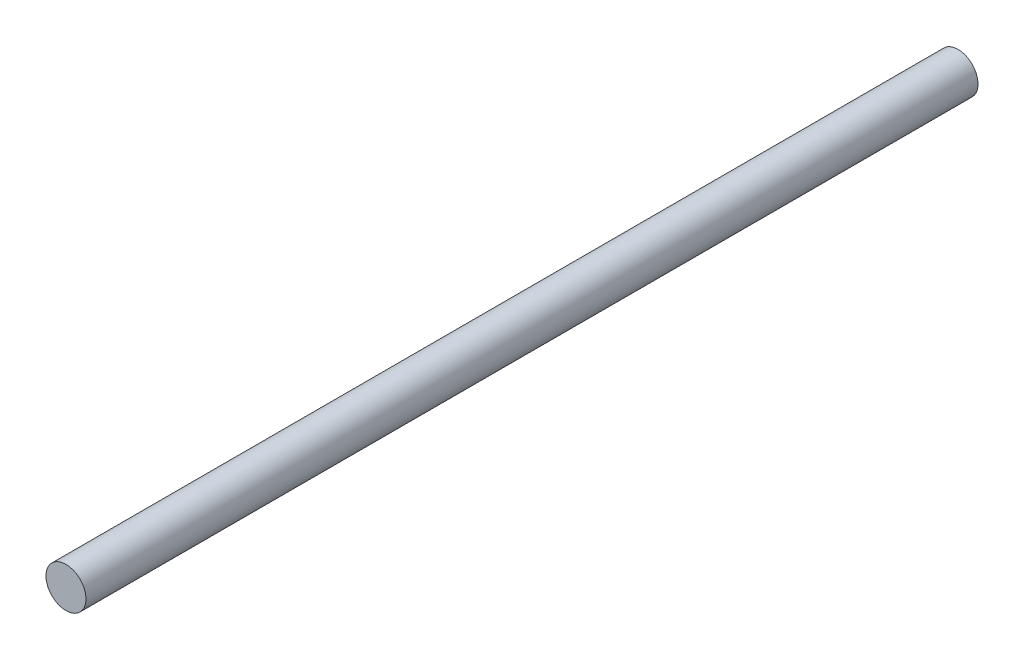
ISO-10303-21;
HEADER;
FILE_DESCRIPTION(('STEP AP214'),'2;1');
FILE_NAME('part.step','',(''),(''),'','','');
FILE_SCHEMA(('AUTOMOTIVE_DESIGN { 1 0 10303 214 1 1 1 1 }'));
ENDSEC;
DATA;
#1=APPLICATION_CONTEXT('core data for automotive mechanical design processes');
#2=APPLICATION_PROTOCOL_DEFINITION('international standard','automotive_design',2000,#1);
#3=PRODUCT_CONTEXT('',#1,'mechanical');
#4=PRODUCT('Part','Part','',(#3));
#5=PRODUCT_RELATED_PRODUCT_CATEGORY('part','',(#4));
#6=PRODUCT_DEFINITION_FORMATION('','',#4);
#7=PRODUCT_DEFINITION_CONTEXT('part definition',#1,'design');
#8=PRODUCT_DEFINITION('design','',#6,#7);
#9=PRODUCT_DEFINITION_SHAPE('','',#8);
#10=(LENGTH_UNIT() NAMED_UNIT(*) SI_UNIT(.MILLI.,.METRE.));
#11=(NAMED_UNIT(*) PLANE_ANGLE_UNIT() SI_UNIT($,.RADIAN.));
#12=(NAMED_UNIT(*) SI_UNIT($,.STERADIAN.) SOLID_ANGLE_UNIT());
#13=UNCERTAINTY_MEASURE_WITH_UNIT(LENGTH_MEASURE(1.E-05),#10,'distance_accuracy_value','');
#14=(GEOMETRIC_REPRESENTATION_CONTEXT(3) GLOBAL_UNCERTAINTY_ASSIGNED_CONTEXT((#13)) GLOBAL_UNIT_ASSIGNED_CONTEXT((#10,
#11,#12)) REPRESENTATION_CONTEXT('',''));
#15=CARTESIAN_POINT('',(0.,0.,0.));
#16=DIRECTION('',(0.,0.,1.));
#17=DIRECTION('',(1.,0.,0.));
#18=AXIS2_PLACEMENT_3D('',#15,#16,#17);
#19=CARTESIAN_POINT('',(0.,0.,150.));
#20=DIRECTION('',(0.,0.,-1.));
#21=DIRECTION('',(-1.,0.,0.));
#22=AXIS2_PLACEMENT_3D('',#19,#20,#21);
#23=CYLINDRICAL_SURFACE('',#22,3.365);
#24=CARTESIAN_POINT('',(0.,0.,150.));
#25=DIRECTION('',(0.,0.,1.));
#26=DIRECTION('',(1.,0.,0.));
#27=AXIS2_PLACEMENT_3D('',#24,#25,#26);
#28=CIRCLE('',#27,3.365);
#29=CARTESIAN_POINT('',(3.365,0.,150.));
#30=VERTEX_POINT('',#29);
#31=EDGE_CURVE('E10',#30,#30,#28,.T.);
#32=ORIENTED_EDGE('',*,*,#31,.F.);
#33=EDGE_LOOP('',(#32));
#34=FACE_BOUND('',#33,.T.);
#35=CARTESIAN_POINT('',(0.,0.,0.));
#36=DIRECTION('',(0.,0.,1.));
#37=DIRECTION('',(1.,0.,0.));
#38=AXIS2_PLACEMENT_3D('',#35,#36,#37);
#39=CIRCLE('',#38,3.365);
#40=CARTESIAN_POINT('',(3.365,0.,0.));
#41=VERTEX_POINT('',#40);
#42=EDGE_CURVE('E36',#41,#41,#39,.T.);
#43=ORIENTED_EDGE('',*,*,#42,.T.);
#44=EDGE_LOOP('',(#43));
#45=FACE_BOUND('',#44,.T.);
#46=ADVANCED_FACE('F33',(#34,#45),#23,.T.);
#47=CARTESIAN_POINT('',(0.,0.,150.));
#48=DIRECTION('',(0.,0.,1.));
#49=DIRECTION('',(1.,0.,0.));
#50=AXIS2_PLACEMENT_3D('',#47,#48,#49);
#51=PLANE('',#50);
#52=ORIENTED_EDGE('',*,*,#31,.T.);
#53=EDGE_LOOP('',(#52));
#54=FACE_BOUND('',#53,.T.);
#55=ADVANCED_FACE('F48',(#54),#51,.T.);
#56=CARTESIAN_POINT('',(0.,0.,0.));
#57=DIRECTION('',(0.,0.,1.));
#58=DIRECTION('',(1.,0.,0.));
#59=AXIS2_PLACEMENT_3D('',#56,#57,#58);
#60=PLANE('',#59);
#61=ORIENTED_EDGE('',*,*,#42,.F.);
#62=EDGE_LOOP('',(#61));
#63=FACE_BOUND('',#62,.T.);
#64=ADVANCED_FACE('F46',(#63),#60,.F.);
#65=CLOSED_SHELL('',(#46,#55,#64));
#66=MANIFOLD_SOLID_BREP('B2',#65);
#67=ADVANCED_BREP_SHAPE_REPRESENTATION('',(#18,#66),#14);
#68=SHAPE_DEFINITION_REPRESENTATION(#9,#67);
ENDSEC;
END-ISO-10303-21;
